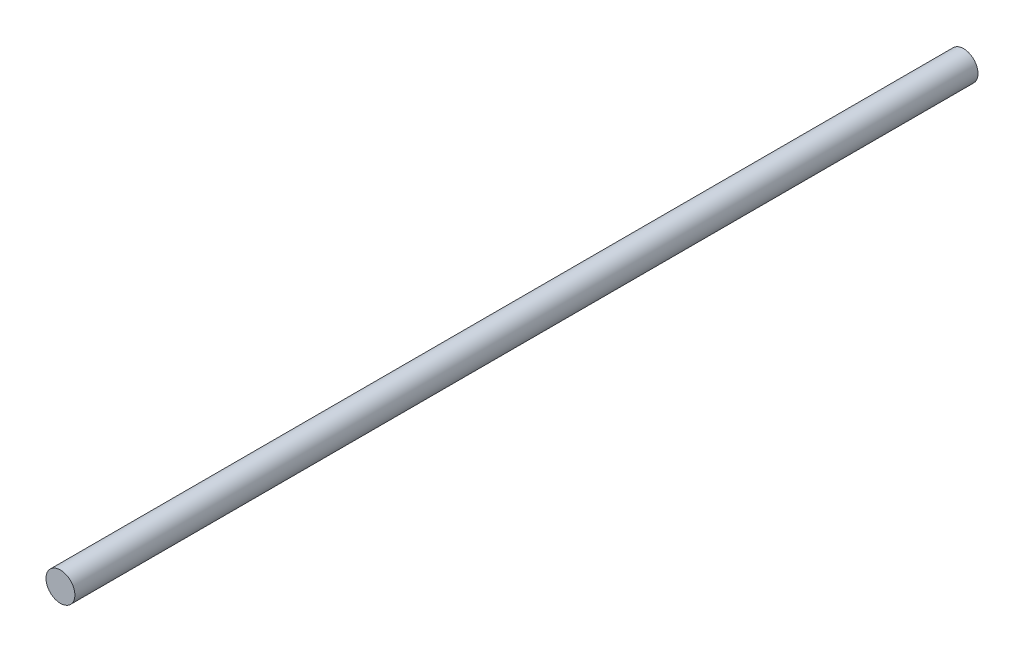
ISO-10303-21;
HEADER;
FILE_DESCRIPTION(('STEP AP214'),'2;1');
FILE_NAME('part.step','',(''),(''),'','','');
FILE_SCHEMA(('AUTOMOTIVE_DESIGN { 1 0 10303 214 1 1 1 1 }'));
ENDSEC;
DATA;
#1=APPLICATION_CONTEXT('core data for automotive mechanical design processes');
#2=APPLICATION_PROTOCOL_DEFINITION('international standard','automotive_design',2000,#1);
#3=PRODUCT_CONTEXT('',#1,'mechanical');
#4=PRODUCT('Part','Part','',(#3));
#5=PRODUCT_RELATED_PRODUCT_CATEGORY('part','',(#4));
#6=PRODUCT_DEFINITION_FORMATION('','',#4);
#7=PRODUCT_DEFINITION_CONTEXT('part definition',#1,'design');
#8=PRODUCT_DEFINITION('design','',#6,#7);
#9=PRODUCT_DEFINITION_SHAPE('','',#8);
#10=(LENGTH_UNIT() NAMED_UNIT(*) SI_UNIT(.MILLI.,.METRE.));
#11=(NAMED_UNIT(*) PLANE_ANGLE_UNIT() SI_UNIT($,.RADIAN.));
#12=(NAMED_UNIT(*) SI_UNIT($,.STERADIAN.) SOLID_ANGLE_UNIT());
#13=UNCERTAINTY_MEASURE_WITH_UNIT(LENGTH_MEASURE(1.E-05),#10,'distance_accuracy_value','');
#14=(GEOMETRIC_REPRESENTATION_CONTEXT(3) GLOBAL_UNCERTAINTY_ASSIGNED_CONTEXT((#13)) GLOBAL_UNIT_ASSIGNED_CONTEXT((#10,
#11,#12)) REPRESENTATION_CONTEXT('',''));
#15=CARTESIAN_POINT('',(0.,0.,0.));
#16=DIRECTION('',(0.,0.,1.));
#17=DIRECTION('',(1.,0.,0.));
#18=AXIS2_PLACEMENT_3D('',#15,#16,#17);
#19=CARTESIAN_POINT('',(-5.98713688873571,4.96448928351687,250.));
#20=DIRECTION('',(0.,0.,-1.));
#21=DIRECTION('',(-1.,0.,0.));
#22=AXIS2_PLACEMENT_3D('',#19,#20,#21);
#23=CYLINDRICAL_SURFACE('',#22,4.);
#24=CARTESIAN_POINT('',(-5.98713688873571,4.96448928351687,250.));
#25=DIRECTION('',(0.,0.,1.));
#26=DIRECTION('',(1.,0.,0.));
#27=AXIS2_PLACEMENT_3D('',#24,#25,#26);
#28=CIRCLE('',#27,4.);
#29=CARTESIAN_POINT('',(-1.98713688873571,4.96448928351687,250.));
#30=VERTEX_POINT('',#29);
#31=EDGE_CURVE('E12',#30,#30,#28,.T.);
#32=ORIENTED_EDGE('',*,*,#31,.F.);
#33=EDGE_LOOP('',(#32));
#34=FACE_BOUND('',#33,.T.);
#35=CARTESIAN_POINT('',(-5.98713688873571,4.96448928351687,0.));
#36=DIRECTION('',(0.,0.,1.));
#37=DIRECTION('',(1.,0.,0.));
#38=AXIS2_PLACEMENT_3D('',#35,#36,#37);
#39=CIRCLE('',#38,4.);
#40=CARTESIAN_POINT('',(-1.98713688873571,4.96448928351687,0.));
#41=VERTEX_POINT('',#40);
#42=EDGE_CURVE('E44',#41,#41,#39,.T.);
#43=ORIENTED_EDGE('',*,*,#42,.T.);
#44=EDGE_LOOP('',(#43));
#45=FACE_BOUND('',#44,.T.);
#46=ADVANCED_FACE('F41',(#34,#45),#23,.T.);
#47=CARTESIAN_POINT('',(-5.98713688873571,4.96448928351687,250.));
#48=DIRECTION('',(0.,0.,1.));
#49=DIRECTION('',(1.,0.,0.));
#50=AXIS2_PLACEMENT_3D('',#47,#48,#49);
#51=PLANE('',#50);
#52=ORIENTED_EDGE('',*,*,#31,.T.);
#53=EDGE_LOOP('',(#52));
#54=FACE_BOUND('',#53,.T.);
#55=ADVANCED_FACE('F56',(#54),#51,.T.);
#56=CARTESIAN_POINT('',(-5.98713688873571,4.96448928351687,0.));
#57=DIRECTION('',(0.,0.,1.));
#58=DIRECTION('',(1.,0.,0.));
#59=AXIS2_PLACEMENT_3D('',#56,#57,#58);
#60=PLANE('',#59);
#61=ORIENTED_EDGE('',*,*,#42,.F.);
#62=EDGE_LOOP('',(#61));
#63=FACE_BOUND('',#62,.T.);
#64=ADVANCED_FACE('F54',(#63),#60,.F.);
#65=CLOSED_SHELL('',(#46,#55,#64));
#66=MANIFOLD_SOLID_BREP('B2',#65);
#67=ADVANCED_BREP_SHAPE_REPRESENTATION('',(#18,#66),#14);
#68=SHAPE_DEFINITION_REPRESENTATION(#9,#67);
ENDSEC;
END-ISO-10303-21;
